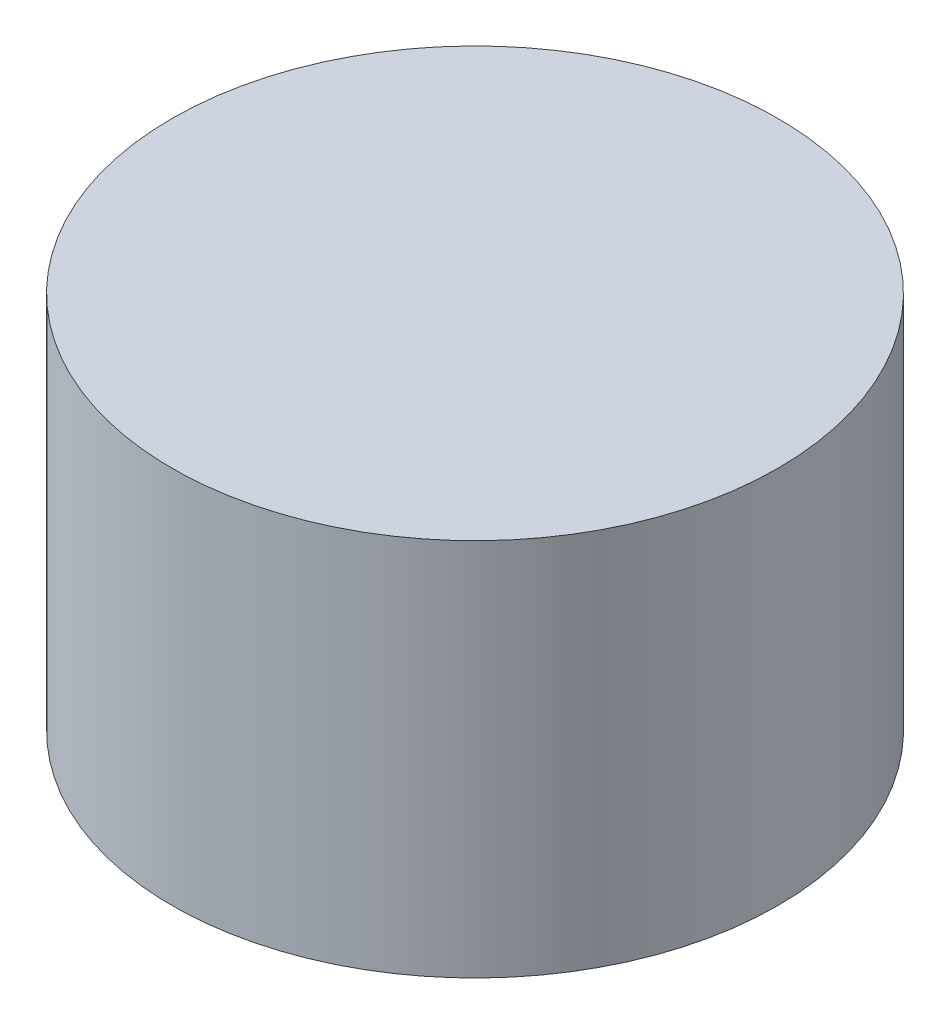
ISO-10303-21;
HEADER;
FILE_DESCRIPTION(('STEP AP214'),'2;1');
FILE_NAME('part.step','',(''),(''),'','','');
FILE_SCHEMA(('AUTOMOTIVE_DESIGN { 1 0 10303 214 1 1 1 1 }'));
ENDSEC;
DATA;
#1=APPLICATION_CONTEXT('core data for automotive mechanical design processes');
#2=APPLICATION_PROTOCOL_DEFINITION('international standard','automotive_design',2000,#1);
#3=PRODUCT_CONTEXT('',#1,'mechanical');
#4=PRODUCT('Part','Part','',(#3));
#5=PRODUCT_RELATED_PRODUCT_CATEGORY('part','',(#4));
#6=PRODUCT_DEFINITION_FORMATION('','',#4);
#7=PRODUCT_DEFINITION_CONTEXT('part definition',#1,'design');
#8=PRODUCT_DEFINITION('design','',#6,#7);
#9=PRODUCT_DEFINITION_SHAPE('','',#8);
#10=(LENGTH_UNIT() NAMED_UNIT(*) SI_UNIT(.MILLI.,.METRE.));
#11=(NAMED_UNIT(*) PLANE_ANGLE_UNIT() SI_UNIT($,.RADIAN.));
#12=(NAMED_UNIT(*) SI_UNIT($,.STERADIAN.) SOLID_ANGLE_UNIT());
#13=UNCERTAINTY_MEASURE_WITH_UNIT(LENGTH_MEASURE(1.E-05),#10,'distance_accuracy_value','');
#14=(GEOMETRIC_REPRESENTATION_CONTEXT(3) GLOBAL_UNCERTAINTY_ASSIGNED_CONTEXT((#13)) GLOBAL_UNIT_ASSIGNED_CONTEXT((#10,
#11,#12)) REPRESENTATION_CONTEXT('',''));
#15=CARTESIAN_POINT('',(0.,0.,0.));
#16=DIRECTION('',(0.,0.,1.));
#17=DIRECTION('',(1.,0.,0.));
#18=AXIS2_PLACEMENT_3D('',#15,#16,#17);
#19=CARTESIAN_POINT('',(0.,0.,0.));
#20=DIRECTION('',(0.,1.,0.));
#21=DIRECTION('',(-1.,0.,0.));
#22=AXIS2_PLACEMENT_3D('',#19,#20,#21);
#23=TOROIDAL_SURFACE('',#22,17.5,1.);
#24=CARTESIAN_POINT('',(0.,0.,0.));
#25=DIRECTION('',(0.,1.,0.));
#26=DIRECTION('',(-1.,0.,0.));
#27=AXIS2_PLACEMENT_3D('',#24,#25,#26);
#28=CIRCLE('',#27,18.5);
#29=CARTESIAN_POINT('',(-18.5,0.,0.));
#30=VERTEX_POINT('',#29);
#31=EDGE_CURVE('E11',#30,#30,#28,.T.);
#32=ORIENTED_EDGE('',*,*,#31,.F.);
#33=EDGE_LOOP('',(#32));
#34=FACE_BOUND('',#33,.T.);
#35=CARTESIAN_POINT('',(0.,0.,0.));
#36=DIRECTION('',(0.,1.,0.));
#37=DIRECTION('',(-1.,0.,0.));
#38=AXIS2_PLACEMENT_3D('',#35,#36,#37);
#39=CIRCLE('',#38,16.5);
#40=CARTESIAN_POINT('',(-16.5,0.,0.));
#41=VERTEX_POINT('',#40);
#42=EDGE_CURVE('E74',#41,#41,#39,.T.);
#43=ORIENTED_EDGE('',*,*,#42,.T.);
#44=EDGE_LOOP('',(#43));
#45=FACE_BOUND('',#44,.T.);
#46=ADVANCED_FACE('F37',(#34,#45),#23,.F.);
#47=CARTESIAN_POINT('',(18.5,0.,0.));
#48=DIRECTION('',(0.,1.,0.));
#49=DIRECTION('',(-1.,0.,0.));
#50=AXIS2_PLACEMENT_3D('',#47,#48,#49);
#51=PLANE('',#50);
#52=CARTESIAN_POINT('',(0.,0.,0.));
#53=DIRECTION('',(0.,1.,0.));
#54=DIRECTION('',(-1.,0.,0.));
#55=AXIS2_PLACEMENT_3D('',#52,#53,#54);
#56=CIRCLE('',#55,20.);
#57=CARTESIAN_POINT('',(-20.,0.,0.));
#58=VERTEX_POINT('',#57);
#59=EDGE_CURVE('E43',#58,#58,#56,.T.);
#60=ORIENTED_EDGE('',*,*,#59,.F.);
#61=EDGE_LOOP('',(#60));
#62=FACE_BOUND('',#61,.T.);
#63=ORIENTED_EDGE('',*,*,#31,.T.);
#64=EDGE_LOOP('',(#63));
#65=FACE_BOUND('',#64,.T.);
#66=ADVANCED_FACE('F64',(#62,#65),#51,.F.);
#67=CARTESIAN_POINT('',(0.,20.,0.));
#68=DIRECTION('',(0.,1.,0.));
#69=DIRECTION('',(-1.,0.,0.));
#70=AXIS2_PLACEMENT_3D('',#67,#68,#69);
#71=CYLINDRICAL_SURFACE('',#70,20.);
#72=CARTESIAN_POINT('',(0.,25.,0.));
#73=DIRECTION('',(0.,1.,0.));
#74=DIRECTION('',(-1.,0.,0.));
#75=AXIS2_PLACEMENT_3D('',#72,#73,#74);
#76=CIRCLE('',#75,20.);
#77=CARTESIAN_POINT('',(-20.,25.,0.));
#78=VERTEX_POINT('',#77);
#79=EDGE_CURVE('E78',#78,#78,#76,.T.);
#80=ORIENTED_EDGE('',*,*,#79,.F.);
#81=EDGE_LOOP('',(#80));
#82=FACE_BOUND('',#81,.T.);
#83=ORIENTED_EDGE('',*,*,#59,.T.);
#84=EDGE_LOOP('',(#83));
#85=FACE_BOUND('',#84,.T.);
#86=ADVANCED_FACE('F58',(#82,#85),#71,.T.);
#87=CARTESIAN_POINT('',(20.,25.,0.));
#88=DIRECTION('',(0.,-1.,0.));
#89=DIRECTION('',(1.,0.,0.));
#90=AXIS2_PLACEMENT_3D('',#87,#88,#89);
#91=PLANE('',#90);
#92=ORIENTED_EDGE('',*,*,#79,.T.);
#93=EDGE_LOOP('',(#92));
#94=FACE_BOUND('',#93,.T.);
#95=ADVANCED_FACE('F49',(#94),#91,.F.);
#96=CARTESIAN_POINT('',(0.,20.,0.));
#97=CARTESIAN_POINT('',(15.,20.,0.));
#98=CARTESIAN_POINT('',(15.,0.,0.));
#99=(BOUNDED_CURVE() B_SPLINE_CURVE(2,(#96,#97,#98),.UNSPECIFIED.,.F.,
.F.) B_SPLINE_CURVE_WITH_KNOTS((3,3),(0.,1.),
.UNSPECIFIED.) CURVE() GEOMETRIC_REPRESENTATION_ITEM() RATIONAL_B_SPLINE_CURVE((1.,
0.428571428571429,1.)) REPRESENTATION_ITEM(''));
#100=CARTESIAN_POINT('',(0.,20.,0.));
#101=DIRECTION('',(0.,1.,0.));
#102=AXIS1_PLACEMENT('',#100,#101);
#103=SURFACE_OF_REVOLUTION('',#99,#102);
#104=CARTESIAN_POINT('',(0.,0.,0.));
#105=DIRECTION('',(0.,1.,0.));
#106=DIRECTION('',(-1.,0.,0.));
#107=AXIS2_PLACEMENT_3D('',#104,#105,#106);
#108=CIRCLE('',#107,15.);
#109=CARTESIAN_POINT('',(-15.,0.,0.));
#110=VERTEX_POINT('',#109);
#111=EDGE_CURVE('E75',#110,#110,#108,.T.);
#112=ORIENTED_EDGE('',*,*,#111,.F.);
#113=EDGE_LOOP('',(#112));
#114=FACE_BOUND('',#113,.T.);
#115=CARTESIAN_POINT('',(0.,20.,0.));
#116=VERTEX_POINT('',#115);
#117=VERTEX_LOOP('',#116);
#118=FACE_BOUND('',#117,.T.);
#119=ADVANCED_FACE('F46',(#114,#118),#103,.T.);
#120=CARTESIAN_POINT('',(15.,0.,0.));
#121=DIRECTION('',(0.,1.,0.));
#122=DIRECTION('',(-1.,0.,0.));
#123=AXIS2_PLACEMENT_3D('',#120,#121,#122);
#124=PLANE('',#123);
#125=ORIENTED_EDGE('',*,*,#42,.F.);
#126=EDGE_LOOP('',(#125));
#127=FACE_BOUND('',#126,.T.);
#128=ORIENTED_EDGE('',*,*,#111,.T.);
#129=EDGE_LOOP('',(#128));
#130=FACE_BOUND('',#129,.T.);
#131=ADVANCED_FACE('F48',(#127,#130),#124,.F.);
#132=CLOSED_SHELL('',(#46,#66,#86,#95,#119,#131));
#133=MANIFOLD_SOLID_BREP('B2',#132);
#134=ADVANCED_BREP_SHAPE_REPRESENTATION('',(#18,#133),#14);
#135=SHAPE_DEFINITION_REPRESENTATION(#9,#134);
ENDSEC;
END-ISO-10303-21;
